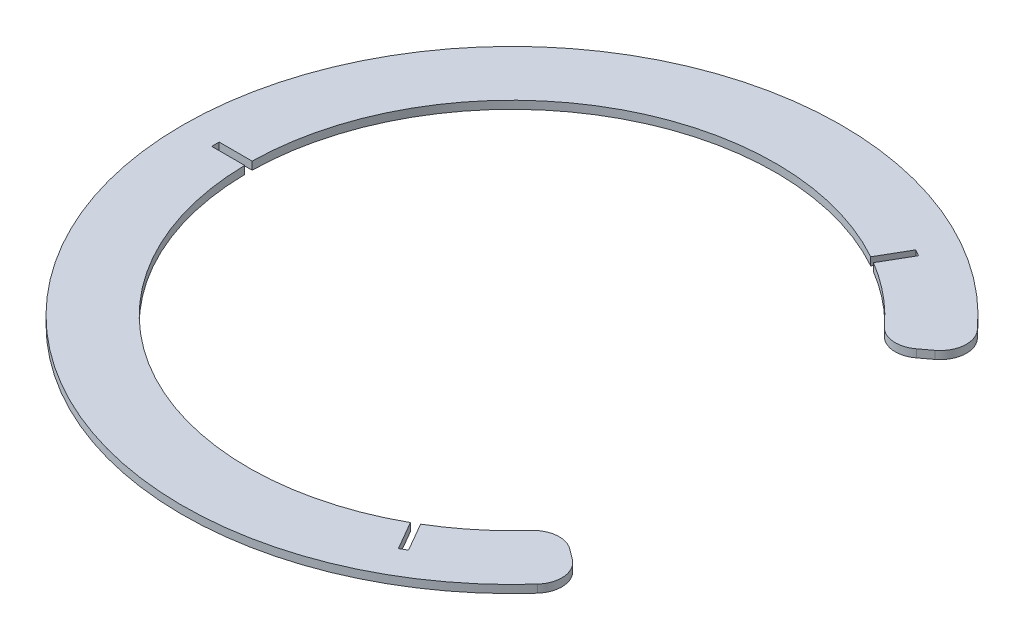
ISO-10303-21;
HEADER;
FILE_DESCRIPTION(('STEP AP214'),'2;1');
FILE_NAME('part.step','',(''),(''),'','','');
FILE_SCHEMA(('AUTOMOTIVE_DESIGN { 1 0 10303 214 1 1 1 1 }'));
ENDSEC;
DATA;
#1=APPLICATION_CONTEXT('core data for automotive mechanical design processes');
#2=APPLICATION_PROTOCOL_DEFINITION('international standard','automotive_design',2000,#1);
#3=PRODUCT_CONTEXT('',#1,'mechanical');
#4=PRODUCT('Part','Part','',(#3));
#5=PRODUCT_RELATED_PRODUCT_CATEGORY('part','',(#4));
#6=PRODUCT_DEFINITION_FORMATION('','',#4);
#7=PRODUCT_DEFINITION_CONTEXT('part definition',#1,'design');
#8=PRODUCT_DEFINITION('design','',#6,#7);
#9=PRODUCT_DEFINITION_SHAPE('','',#8);
#10=(LENGTH_UNIT() NAMED_UNIT(*) SI_UNIT(.MILLI.,.METRE.));
#11=(NAMED_UNIT(*) PLANE_ANGLE_UNIT() SI_UNIT($,.RADIAN.));
#12=(NAMED_UNIT(*) SI_UNIT($,.STERADIAN.) SOLID_ANGLE_UNIT());
#13=UNCERTAINTY_MEASURE_WITH_UNIT(LENGTH_MEASURE(1.E-05),#10,'distance_accuracy_value','');
#14=(GEOMETRIC_REPRESENTATION_CONTEXT(3) GLOBAL_UNCERTAINTY_ASSIGNED_CONTEXT((#13)) GLOBAL_UNIT_ASSIGNED_CONTEXT((#10,
#11,#12)) REPRESENTATION_CONTEXT('',''));
#15=CARTESIAN_POINT('',(0.,0.,0.));
#16=DIRECTION('',(0.,0.,1.));
#17=DIRECTION('',(1.,0.,0.));
#18=AXIS2_PLACEMENT_3D('',#15,#16,#17);
#19=CARTESIAN_POINT('',(0.,0.,0.));
#20=DIRECTION('',(0.,1.,0.));
#21=DIRECTION('',(0.,0.,1.));
#22=AXIS2_PLACEMENT_3D('',#19,#20,#21);
#23=CYLINDRICAL_SURFACE('',#22,100.);
#24=CARTESIAN_POINT('',(0.,0.,0.));
#25=DIRECTION('',(0.,1.,0.));
#26=DIRECTION('',(0.,0.,1.));
#27=AXIS2_PLACEMENT_3D('',#24,#25,#26);
#28=CIRCLE('',#27,100.);
#29=CARTESIAN_POINT('',(74.2141901825696,0.,-67.0242790005636));
#30=VERTEX_POINT('',#29);
#31=CARTESIAN_POINT('',(51.2204201332725,0.,-85.8863700558537));
#32=VERTEX_POINT('',#31);
#33=EDGE_CURVE('E256',#30,#32,#28,.T.);
#34=ORIENTED_EDGE('',*,*,#33,.F.);
#35=DIRECTION('',(0.,1.,0.));
#36=VECTOR('',#35,1.);
#37=CARTESIAN_POINT('',(74.2141901825696,0.,-67.0242790005636));
#38=LINE('',#37,#36);
#39=CARTESIAN_POINT('',(74.2141901825696,3.,-67.0242790005636));
#40=VERTEX_POINT('',#39);
#41=EDGE_CURVE('E11',#30,#40,#38,.T.);
#42=ORIENTED_EDGE('',*,*,#41,.T.);
#43=CARTESIAN_POINT('',(0.,3.,0.));
#44=DIRECTION('',(0.,1.,0.));
#45=DIRECTION('',(0.,0.,1.));
#46=AXIS2_PLACEMENT_3D('',#43,#44,#45);
#47=CIRCLE('',#46,100.);
#48=CARTESIAN_POINT('',(51.2204201332725,3.,-85.8863700558537));
#49=VERTEX_POINT('',#48);
#50=EDGE_CURVE('E262',#40,#49,#47,.T.);
#51=ORIENTED_EDGE('',*,*,#50,.T.);
#52=DIRECTION('',(0.,1.,0.));
#53=VECTOR('',#52,1.);
#54=CARTESIAN_POINT('',(51.2204201332725,0.,-85.8863700558537));
#55=LINE('',#54,#53);
#56=EDGE_CURVE('E277',#49,#32,#55,.F.);
#57=ORIENTED_EDGE('',*,*,#56,.T.);
#58=EDGE_LOOP('',(#34,#42,#51,#57));
#59=FACE_BOUND('',#58,.T.);
#60=ADVANCED_FACE('F33',(#59),#23,.F.);
#61=CARTESIAN_POINT('',(-99.9899883738367,3.,1.415));
#62=VERTEX_POINT('',#61);
#63=CARTESIAN_POINT('',(48.7695682405638,3.,87.301370055853));
#64=VERTEX_POINT('',#63);
#65=EDGE_CURVE('E257',#62,#64,#47,.T.);
#66=ORIENTED_EDGE('',*,*,#65,.T.);
#67=DIRECTION('',(0.,1.,0.));
#68=VECTOR('',#67,1.);
#69=CARTESIAN_POINT('',(48.7695682405638,0.,87.301370055853));
#70=LINE('',#69,#68);
#71=CARTESIAN_POINT('',(48.7695682405638,0.,87.301370055853));
#72=VERTEX_POINT('',#71);
#73=EDGE_CURVE('E281',#64,#72,#70,.F.);
#74=ORIENTED_EDGE('',*,*,#73,.T.);
#75=CARTESIAN_POINT('',(-99.9899883738367,0.,1.415));
#76=VERTEX_POINT('',#75);
#77=EDGE_CURVE('E252',#76,#72,#28,.T.);
#78=ORIENTED_EDGE('',*,*,#77,.F.);
#79=DIRECTION('',(0.,1.,0.));
#80=VECTOR('',#79,1.);
#81=CARTESIAN_POINT('',(-99.9899883738367,0.,1.415));
#82=LINE('',#81,#80);
#83=EDGE_CURVE('E266',#76,#62,#82,.T.);
#84=ORIENTED_EDGE('',*,*,#83,.T.);
#85=EDGE_LOOP('',(#66,#74,#78,#84));
#86=FACE_BOUND('',#85,.T.);
#87=ADVANCED_FACE('F380',(#86),#23,.F.);
#88=CARTESIAN_POINT('',(51.2204201332737,3.,85.886370055853));
#89=VERTEX_POINT('',#88);
#90=CARTESIAN_POINT('',(74.2073939229752,3.,67.0318035499596));
#91=VERTEX_POINT('',#90);
#92=EDGE_CURVE('E261',#89,#91,#47,.T.);
#93=ORIENTED_EDGE('',*,*,#92,.T.);
#94=DIRECTION('',(0.,1.,0.));
#95=VECTOR('',#94,1.);
#96=CARTESIAN_POINT('',(74.2073939229752,0.,67.0318035499596));
#97=LINE('',#96,#95);
#98=CARTESIAN_POINT('',(74.2073939229752,0.,67.0318035499596));
#99=VERTEX_POINT('',#98);
#100=EDGE_CURVE('E297',#91,#99,#97,.F.);
#101=ORIENTED_EDGE('',*,*,#100,.T.);
#102=CARTESIAN_POINT('',(51.2204201332737,0.,85.886370055853));
#103=VERTEX_POINT('',#102);
#104=EDGE_CURVE('E255',#103,#99,#28,.T.);
#105=ORIENTED_EDGE('',*,*,#104,.F.);
#106=DIRECTION('',(0.,1.,0.));
#107=VECTOR('',#106,1.);
#108=CARTESIAN_POINT('',(51.2204201332737,0.,85.886370055853));
#109=LINE('',#108,#107);
#110=EDGE_CURVE('E190',#103,#89,#109,.T.);
#111=ORIENTED_EDGE('',*,*,#110,.T.);
#112=EDGE_LOOP('',(#93,#101,#105,#111));
#113=FACE_BOUND('',#112,.T.);
#114=ADVANCED_FACE('F385',(#113),#23,.F.);
#115=CARTESIAN_POINT('',(0.,3.,0.));
#116=DIRECTION('',(0.,-1.,0.));
#117=DIRECTION('',(0.,0.,-1.));
#118=AXIS2_PLACEMENT_3D('',#115,#116,#117);
#119=CYLINDRICAL_SURFACE('',#118,125.);
#120=CARTESIAN_POINT('',(0.,0.,0.));
#121=DIRECTION('',(0.,1.,0.));
#122=DIRECTION('',(0.,0.,1.));
#123=AXIS2_PLACEMENT_3D('',#120,#121,#122);
#124=CIRCLE('',#123,125.);
#125=CARTESIAN_POINT('',(93.0994716294748,0.,-83.4115602438452));
#126=VERTEX_POINT('',#125);
#127=CARTESIAN_POINT('',(93.0871330036378,0.,83.4253299014337));
#128=VERTEX_POINT('',#127);
#129=EDGE_CURVE('E254',#126,#128,#124,.T.);
#130=ORIENTED_EDGE('',*,*,#129,.T.);
#131=DIRECTION('',(0.,-1.,0.));
#132=VECTOR('',#131,1.);
#133=CARTESIAN_POINT('',(93.0871330036378,3.,83.4253299014337));
#134=LINE('',#133,#132);
#135=CARTESIAN_POINT('',(93.0871330036378,3.,83.4253299014337));
#136=VERTEX_POINT('',#135);
#137=EDGE_CURVE('E308',#128,#136,#134,.F.);
#138=ORIENTED_EDGE('',*,*,#137,.T.);
#139=CARTESIAN_POINT('',(0.,3.,0.));
#140=DIRECTION('',(0.,1.,0.));
#141=DIRECTION('',(0.,0.,1.));
#142=AXIS2_PLACEMENT_3D('',#139,#140,#141);
#143=CIRCLE('',#142,125.);
#144=CARTESIAN_POINT('',(93.0994716294748,3.,-83.4115602438452));
#145=VERTEX_POINT('',#144);
#146=EDGE_CURVE('E263',#145,#136,#143,.T.);
#147=ORIENTED_EDGE('',*,*,#146,.F.);
#148=DIRECTION('',(0.,-1.,0.));
#149=VECTOR('',#148,1.);
#150=CARTESIAN_POINT('',(93.0994716294748,3.,-83.4115602438452));
#151=LINE('',#150,#149);
#152=EDGE_CURVE('E306',#145,#126,#151,.T.);
#153=ORIENTED_EDGE('',*,*,#152,.T.);
#154=EDGE_LOOP('',(#130,#138,#147,#153));
#155=FACE_BOUND('',#154,.T.);
#156=ADVANCED_FACE('F370',(#155),#119,.T.);
#157=CARTESIAN_POINT('',(0.,3.,0.));
#158=DIRECTION('',(0.,1.,0.));
#159=DIRECTION('',(0.,0.,1.));
#160=AXIS2_PLACEMENT_3D('',#157,#158,#159);
#161=PLANE('',#160);
#162=DIRECTION('',(0.799301578633206,0.,0.600930101088691));
#163=VECTOR('',#162,1.);
#164=CARTESIAN_POINT('',(80.,3.,60.));
#165=LINE('',#164,#163);
#166=CARTESIAN_POINT('',(87.6374343261596,3.,65.7419681186235));
#167=VERTEX_POINT('',#166);
#168=CARTESIAN_POINT('',(91.6494633742337,3.,68.7582877229869));
#169=VERTEX_POINT('',#168);
#170=EDGE_CURVE('E323',#167,#169,#165,.T.);
#171=ORIENTED_EDGE('',*,*,#170,.F.);
#172=CARTESIAN_POINT('',(81.6281333152727,3.,73.7349839049556));
#173=DIRECTION('',(0.,1.,0.));
#174=DIRECTION('',(0.,0.,1.));
#175=AXIS2_PLACEMENT_3D('',#172,#173,#174);
#176=CIRCLE('',#175,10.);
#177=EDGE_CURVE('E295',#167,#91,#176,.T.);
#178=ORIENTED_EDGE('',*,*,#177,.T.);
#179=ORIENTED_EDGE('',*,*,#92,.F.);
#180=DIRECTION('',(-0.500000000000004,0.,-0.866025403784436));
#181=VECTOR('',#180,1.);
#182=CARTESIAN_POINT('',(44.9754259463553,3.,75.0697228311382));
#183=LINE('',#182,#181);
#184=CARTESIAN_POINT('',(57.4754259463555,3.,96.7203579257491));
#185=VERTEX_POINT('',#184);
#186=EDGE_CURVE('E198',#185,#89,#183,.T.);
#187=ORIENTED_EDGE('',*,*,#186,.F.);
#188=DIRECTION('',(0.866025403784436,0.,-0.500000000000004));
#189=VECTOR('',#188,1.);
#190=CARTESIAN_POINT('',(57.4754259463555,3.,96.7203579257491));
#191=LINE('',#190,#189);
#192=CARTESIAN_POINT('',(55.0245740536455,3.,98.1353579257491));
#193=VERTEX_POINT('',#192);
#194=EDGE_CURVE('E180',#193,#185,#191,.T.);
#195=ORIENTED_EDGE('',*,*,#194,.F.);
#196=DIRECTION('',(0.500000000000004,0.,0.866025403784436));
#197=VECTOR('',#196,1.);
#198=CARTESIAN_POINT('',(42.5245740536454,3.,76.4847228311382));
#199=LINE('',#198,#197);
#200=EDGE_CURVE('E196',#64,#193,#199,.T.);
#201=ORIENTED_EDGE('',*,*,#200,.F.);
#202=ORIENTED_EDGE('',*,*,#65,.F.);
#203=DIRECTION('',(1.,0.,0.));
#204=VECTOR('',#203,1.);
#205=CARTESIAN_POINT('',(-87.5,3.,1.415));
#206=LINE('',#205,#204);
#207=CARTESIAN_POINT('',(-112.5,3.,1.415));
#208=VERTEX_POINT('',#207);
#209=EDGE_CURVE('E244',#208,#62,#206,.T.);
#210=ORIENTED_EDGE('',*,*,#209,.F.);
#211=DIRECTION('',(0.,0.,1.));
#212=VECTOR('',#211,1.);
#213=CARTESIAN_POINT('',(-112.5,3.,1.415));
#214=LINE('',#213,#212);
#215=CARTESIAN_POINT('',(-112.5,3.,-1.415));
#216=VERTEX_POINT('',#215);
#217=EDGE_CURVE('E208',#216,#208,#214,.T.);
#218=ORIENTED_EDGE('',*,*,#217,.F.);
#219=DIRECTION('',(-1.,0.,0.));
#220=VECTOR('',#219,1.);
#221=CARTESIAN_POINT('',(-87.5,3.,-1.415));
#222=LINE('',#221,#220);
#223=CARTESIAN_POINT('',(-99.9899883738367,3.,-1.415));
#224=VERTEX_POINT('',#223);
#225=EDGE_CURVE('E235',#224,#216,#222,.T.);
#226=ORIENTED_EDGE('',*,*,#225,.F.);
#227=CARTESIAN_POINT('',(48.7695682405626,3.,-87.3013700558537));
#228=VERTEX_POINT('',#227);
#229=EDGE_CURVE('E250',#228,#224,#47,.T.);
#230=ORIENTED_EDGE('',*,*,#229,.F.);
#231=DIRECTION('',(-0.499999999999992,0.,0.866025403784443));
#232=VECTOR('',#231,1.);
#233=CARTESIAN_POINT('',(42.5245740536443,3.,-76.4847228311388));
#234=LINE('',#233,#232);
#235=CARTESIAN_POINT('',(55.0245740536441,3.,-98.1353579257499));
#236=VERTEX_POINT('',#235);
#237=EDGE_CURVE('E224',#236,#228,#234,.T.);
#238=ORIENTED_EDGE('',*,*,#237,.F.);
#239=DIRECTION('',(-0.866025403784443,0.,-0.499999999999992));
#240=VECTOR('',#239,1.);
#241=CARTESIAN_POINT('',(55.0245740536441,3.,-98.1353579257499));
#242=LINE('',#241,#240);
#243=CARTESIAN_POINT('',(57.4754259463541,3.,-96.7203579257499));
#244=VERTEX_POINT('',#243);
#245=EDGE_CURVE('E221',#244,#236,#242,.T.);
#246=ORIENTED_EDGE('',*,*,#245,.F.);
#247=DIRECTION('',(0.499999999999992,0.,-0.866025403784443));
#248=VECTOR('',#247,1.);
#249=CARTESIAN_POINT('',(44.9754259463543,3.,-75.0697228311388));
#250=LINE('',#249,#248);
#251=EDGE_CURVE('E214',#49,#244,#250,.T.);
#252=ORIENTED_EDGE('',*,*,#251,.F.);
#253=ORIENTED_EDGE('',*,*,#50,.F.);
#254=CARTESIAN_POINT('',(81.6356092008266,3.,-73.7267069006199));
#255=DIRECTION('',(0.,1.,0.));
#256=DIRECTION('',(0.,0.,1.));
#257=AXIS2_PLACEMENT_3D('',#254,#255,#256);
#258=CIRCLE('',#257,10.);
#259=CARTESIAN_POINT('',(87.6356092008266,3.,-65.7267069006199));
#260=VERTEX_POINT('',#259);
#261=EDGE_CURVE('E289',#40,#260,#258,.T.);
#262=ORIENTED_EDGE('',*,*,#261,.T.);
#263=DIRECTION('',(-0.8,0.,0.6));
#264=VECTOR('',#263,1.);
#265=CARTESIAN_POINT('',(80.,3.,-60.));
#266=LINE('',#265,#264);
#267=CARTESIAN_POINT('',(91.6515138991168,3.,-68.7386354243376));
#268=VERTEX_POINT('',#267);
#269=EDGE_CURVE('E201',#268,#260,#266,.T.);
#270=ORIENTED_EDGE('',*,*,#269,.F.);
#271=CARTESIAN_POINT('',(85.6515138991168,3.,-76.7386354243376));
#272=DIRECTION('',(0.,1.,0.));
#273=DIRECTION('',(0.,0.,1.));
#274=AXIS2_PLACEMENT_3D('',#271,#272,#273);
#275=CIRCLE('',#274,10.);
#276=EDGE_CURVE('E291',#268,#145,#275,.T.);
#277=ORIENTED_EDGE('',*,*,#276,.T.);
#278=ORIENTED_EDGE('',*,*,#146,.T.);
#279=CARTESIAN_POINT('',(85.6401623633468,3.,76.751303509319));
#280=DIRECTION('',(0.,1.,0.));
#281=DIRECTION('',(0.,0.,1.));
#282=AXIS2_PLACEMENT_3D('',#279,#280,#281);
#283=CIRCLE('',#282,10.);
#284=EDGE_CURVE('E293',#136,#169,#283,.T.);
#285=ORIENTED_EDGE('',*,*,#284,.T.);
#286=EDGE_LOOP('',(#171,#178,#179,#187,#195,#201,#202,#210,#218,#226,#230,#238,#246,#252,#253,
#262,#270,#277,#278,#285));
#287=FACE_BOUND('',#286,.T.);
#288=ADVANCED_FACE('F319',(#287),#161,.T.);
#289=CARTESIAN_POINT('',(0.,0.,0.));
#290=DIRECTION('',(0.,1.,0.));
#291=DIRECTION('',(0.,0.,1.));
#292=AXIS2_PLACEMENT_3D('',#289,#290,#291);
#293=PLANE('',#292);
#294=ORIENTED_EDGE('',*,*,#104,.T.);
#295=CARTESIAN_POINT('',(81.6281333152727,0.,73.7349839049556));
#296=DIRECTION('',(0.,1.,0.));
#297=DIRECTION('',(0.,0.,1.));
#298=AXIS2_PLACEMENT_3D('',#295,#296,#297);
#299=CIRCLE('',#298,10.);
#300=CARTESIAN_POINT('',(87.6374343261596,0.,65.7419681186235));
#301=VERTEX_POINT('',#300);
#302=EDGE_CURVE('E304',#99,#301,#299,.F.);
#303=ORIENTED_EDGE('',*,*,#302,.T.);
#304=DIRECTION('',(0.799301578633206,0.,0.600930101088691));
#305=VECTOR('',#304,1.);
#306=CARTESIAN_POINT('',(80.,0.,60.));
#307=LINE('',#306,#305);
#308=CARTESIAN_POINT('',(91.6494633742337,0.,68.7582877229869));
#309=VERTEX_POINT('',#308);
#310=EDGE_CURVE('E322',#301,#309,#307,.T.);
#311=ORIENTED_EDGE('',*,*,#310,.T.);
#312=CARTESIAN_POINT('',(85.6401623633468,0.,76.751303509319));
#313=DIRECTION('',(0.,1.,0.));
#314=DIRECTION('',(0.,0.,1.));
#315=AXIS2_PLACEMENT_3D('',#312,#313,#314);
#316=CIRCLE('',#315,10.);
#317=EDGE_CURVE('E302',#309,#128,#316,.F.);
#318=ORIENTED_EDGE('',*,*,#317,.T.);
#319=ORIENTED_EDGE('',*,*,#129,.F.);
#320=CARTESIAN_POINT('',(85.6515138991168,0.,-76.7386354243376));
#321=DIRECTION('',(0.,1.,0.));
#322=DIRECTION('',(0.,0.,1.));
#323=AXIS2_PLACEMENT_3D('',#320,#321,#322);
#324=CIRCLE('',#323,10.);
#325=CARTESIAN_POINT('',(91.6515138991168,0.,-68.7386354243376));
#326=VERTEX_POINT('',#325);
#327=EDGE_CURVE('E300',#126,#326,#324,.F.);
#328=ORIENTED_EDGE('',*,*,#327,.T.);
#329=DIRECTION('',(-0.8,0.,0.6));
#330=VECTOR('',#329,1.);
#331=CARTESIAN_POINT('',(80.,0.,-60.));
#332=LINE('',#331,#330);
#333=CARTESIAN_POINT('',(87.6356092008266,0.,-65.7267069006199));
#334=VERTEX_POINT('',#333);
#335=EDGE_CURVE('E225',#326,#334,#332,.T.);
#336=ORIENTED_EDGE('',*,*,#335,.T.);
#337=CARTESIAN_POINT('',(81.6356092008266,0.,-73.7267069006199));
#338=DIRECTION('',(0.,1.,0.));
#339=DIRECTION('',(0.,0.,1.));
#340=AXIS2_PLACEMENT_3D('',#337,#338,#339);
#341=CIRCLE('',#340,10.);
#342=EDGE_CURVE('E48',#334,#30,#341,.F.);
#343=ORIENTED_EDGE('',*,*,#342,.T.);
#344=ORIENTED_EDGE('',*,*,#33,.T.);
#345=DIRECTION('',(0.499999999999992,0.,-0.866025403784443));
#346=VECTOR('',#345,1.);
#347=CARTESIAN_POINT('',(44.9754259463543,0.,-75.0697228311388));
#348=LINE('',#347,#346);
#349=CARTESIAN_POINT('',(57.4754259463541,0.,-96.7203579257499));
#350=VERTEX_POINT('',#349);
#351=EDGE_CURVE('E217',#32,#350,#348,.T.);
#352=ORIENTED_EDGE('',*,*,#351,.T.);
#353=DIRECTION('',(-0.866025403784443,0.,-0.499999999999992));
#354=VECTOR('',#353,1.);
#355=CARTESIAN_POINT('',(55.0245740536441,0.,-98.1353579257499));
#356=LINE('',#355,#354);
#357=CARTESIAN_POINT('',(55.0245740536441,0.,-98.1353579257499));
#358=VERTEX_POINT('',#357);
#359=EDGE_CURVE('E210',#350,#358,#356,.T.);
#360=ORIENTED_EDGE('',*,*,#359,.T.);
#361=DIRECTION('',(-0.499999999999992,0.,0.866025403784443));
#362=VECTOR('',#361,1.);
#363=CARTESIAN_POINT('',(42.5245740536443,0.,-76.4847228311388));
#364=LINE('',#363,#362);
#365=CARTESIAN_POINT('',(48.7695682405626,0.,-87.3013700558537));
#366=VERTEX_POINT('',#365);
#367=EDGE_CURVE('E213',#358,#366,#364,.T.);
#368=ORIENTED_EDGE('',*,*,#367,.T.);
#369=CARTESIAN_POINT('',(-99.9899883738367,0.,-1.415));
#370=VERTEX_POINT('',#369);
#371=EDGE_CURVE('E260',#366,#370,#28,.T.);
#372=ORIENTED_EDGE('',*,*,#371,.T.);
#373=DIRECTION('',(-1.,0.,0.));
#374=VECTOR('',#373,1.);
#375=CARTESIAN_POINT('',(-87.5,0.,-1.415));
#376=LINE('',#375,#374);
#377=CARTESIAN_POINT('',(-112.5,0.,-1.415));
#378=VERTEX_POINT('',#377);
#379=EDGE_CURVE('E238',#370,#378,#376,.T.);
#380=ORIENTED_EDGE('',*,*,#379,.T.);
#381=DIRECTION('',(0.,0.,1.));
#382=VECTOR('',#381,1.);
#383=CARTESIAN_POINT('',(-112.5,0.,1.415));
#384=LINE('',#383,#382);
#385=CARTESIAN_POINT('',(-112.5,0.,1.415));
#386=VERTEX_POINT('',#385);
#387=EDGE_CURVE('E231',#378,#386,#384,.T.);
#388=ORIENTED_EDGE('',*,*,#387,.T.);
#389=DIRECTION('',(1.,0.,0.));
#390=VECTOR('',#389,1.);
#391=CARTESIAN_POINT('',(-87.5,0.,1.415));
#392=LINE('',#391,#390);
#393=EDGE_CURVE('E234',#386,#76,#392,.T.);
#394=ORIENTED_EDGE('',*,*,#393,.T.);
#395=ORIENTED_EDGE('',*,*,#77,.T.);
#396=DIRECTION('',(0.500000000000004,0.,0.866025403784436));
#397=VECTOR('',#396,1.);
#398=CARTESIAN_POINT('',(42.5245740536454,0.,76.4847228311382));
#399=LINE('',#398,#397);
#400=CARTESIAN_POINT('',(55.0245740536455,0.,98.1353579257491));
#401=VERTEX_POINT('',#400);
#402=EDGE_CURVE('E184',#72,#401,#399,.T.);
#403=ORIENTED_EDGE('',*,*,#402,.T.);
#404=DIRECTION('',(0.866025403784436,0.,-0.500000000000004));
#405=VECTOR('',#404,1.);
#406=CARTESIAN_POINT('',(57.4754259463555,0.,96.7203579257491));
#407=LINE('',#406,#405);
#408=CARTESIAN_POINT('',(57.4754259463555,0.,96.7203579257491));
#409=VERTEX_POINT('',#408);
#410=EDGE_CURVE('E177',#401,#409,#407,.T.);
#411=ORIENTED_EDGE('',*,*,#410,.T.);
#412=DIRECTION('',(-0.500000000000004,0.,-0.866025403784436));
#413=VECTOR('',#412,1.);
#414=CARTESIAN_POINT('',(44.9754259463553,0.,75.0697228311382));
#415=LINE('',#414,#413);
#416=EDGE_CURVE('E187',#409,#103,#415,.T.);
#417=ORIENTED_EDGE('',*,*,#416,.T.);
#418=EDGE_LOOP('',(#294,#303,#311,#318,#319,#328,#336,#343,#344,#352,#360,#368,#372,#380,#388,
#394,#395,#403,#411,#417));
#419=FACE_BOUND('',#418,.T.);
#420=ADVANCED_FACE('F194',(#419),#293,.F.);
#421=ORIENTED_EDGE('',*,*,#371,.F.);
#422=DIRECTION('',(0.,1.,0.));
#423=VECTOR('',#422,1.);
#424=CARTESIAN_POINT('',(48.7695682405625,0.,-87.3013700558537));
#425=LINE('',#424,#423);
#426=EDGE_CURVE('E274',#366,#228,#425,.T.);
#427=ORIENTED_EDGE('',*,*,#426,.T.);
#428=ORIENTED_EDGE('',*,*,#229,.T.);
#429=DIRECTION('',(0.,1.,0.));
#430=VECTOR('',#429,1.);
#431=CARTESIAN_POINT('',(-99.9899883738367,0.,-1.415));
#432=LINE('',#431,#430);
#433=EDGE_CURVE('E271',#224,#370,#432,.F.);
#434=ORIENTED_EDGE('',*,*,#433,.T.);
#435=EDGE_LOOP('',(#421,#427,#428,#434));
#436=FACE_BOUND('',#435,.T.);
#437=ADVANCED_FACE('F342',(#436),#23,.F.);
#438=CARTESIAN_POINT('',(-87.5,0.,-1.415));
#439=DIRECTION('',(0.,0.,-1.));
#440=DIRECTION('',(-1.,0.,0.));
#441=AXIS2_PLACEMENT_3D('',#438,#439,#440);
#442=PLANE('',#441);
#443=ORIENTED_EDGE('',*,*,#225,.T.);
#444=DIRECTION('',(0.,1.,0.));
#445=VECTOR('',#444,1.);
#446=CARTESIAN_POINT('',(-112.5,0.,-1.415));
#447=LINE('',#446,#445);
#448=EDGE_CURVE('E247',#378,#216,#447,.T.);
#449=ORIENTED_EDGE('',*,*,#448,.F.);
#450=ORIENTED_EDGE('',*,*,#379,.F.);
#451=ORIENTED_EDGE('',*,*,#433,.F.);
#452=EDGE_LOOP('',(#443,#449,#450,#451));
#453=FACE_BOUND('',#452,.T.);
#454=ADVANCED_FACE('F347',(#453),#442,.F.);
#455=CARTESIAN_POINT('',(-87.5,0.,1.415));
#456=DIRECTION('',(0.,0.,1.));
#457=DIRECTION('',(1.,0.,0.));
#458=AXIS2_PLACEMENT_3D('',#455,#456,#457);
#459=PLANE('',#458);
#460=ORIENTED_EDGE('',*,*,#393,.F.);
#461=DIRECTION('',(0.,1.,0.));
#462=VECTOR('',#461,1.);
#463=CARTESIAN_POINT('',(-112.5,0.,1.415));
#464=LINE('',#463,#462);
#465=EDGE_CURVE('E241',#386,#208,#464,.T.);
#466=ORIENTED_EDGE('',*,*,#465,.T.);
#467=ORIENTED_EDGE('',*,*,#209,.T.);
#468=ORIENTED_EDGE('',*,*,#83,.F.);
#469=EDGE_LOOP('',(#460,#466,#467,#468));
#470=FACE_BOUND('',#469,.T.);
#471=ADVANCED_FACE('F394',(#470),#459,.F.);
#472=CARTESIAN_POINT('',(-112.5,0.,1.415));
#473=DIRECTION('',(-1.,0.,0.));
#474=DIRECTION('',(0.,0.,1.));
#475=AXIS2_PLACEMENT_3D('',#472,#473,#474);
#476=PLANE('',#475);
#477=ORIENTED_EDGE('',*,*,#217,.T.);
#478=ORIENTED_EDGE('',*,*,#465,.F.);
#479=ORIENTED_EDGE('',*,*,#387,.F.);
#480=ORIENTED_EDGE('',*,*,#448,.T.);
#481=EDGE_LOOP('',(#477,#478,#479,#480));
#482=FACE_BOUND('',#481,.T.);
#483=ADVANCED_FACE('F352',(#482),#476,.F.);
#484=CARTESIAN_POINT('',(44.9754259463543,0.,-75.0697228311388));
#485=DIRECTION('',(0.866025403784443,0.,0.499999999999992));
#486=DIRECTION('',(0.499999999999992,0.,-0.866025403784443));
#487=AXIS2_PLACEMENT_3D('',#484,#485,#486);
#488=PLANE('',#487);
#489=ORIENTED_EDGE('',*,*,#251,.T.);
#490=DIRECTION('',(0.,1.,0.));
#491=VECTOR('',#490,1.);
#492=CARTESIAN_POINT('',(57.4754259463541,0.,-96.7203579257499));
#493=LINE('',#492,#491);
#494=EDGE_CURVE('E206',#350,#244,#493,.T.);
#495=ORIENTED_EDGE('',*,*,#494,.F.);
#496=ORIENTED_EDGE('',*,*,#351,.F.);
#497=ORIENTED_EDGE('',*,*,#56,.F.);
#498=EDGE_LOOP('',(#489,#495,#496,#497));
#499=FACE_BOUND('',#498,.T.);
#500=ADVANCED_FACE('F411',(#499),#488,.F.);
#501=CARTESIAN_POINT('',(42.5245740536443,0.,-76.4847228311388));
#502=DIRECTION('',(-0.866025403784443,0.,-0.499999999999992));
#503=DIRECTION('',(-0.499999999999992,0.,0.866025403784443));
#504=AXIS2_PLACEMENT_3D('',#501,#502,#503);
#505=PLANE('',#504);
#506=ORIENTED_EDGE('',*,*,#367,.F.);
#507=DIRECTION('',(0.,1.,0.));
#508=VECTOR('',#507,1.);
#509=CARTESIAN_POINT('',(55.0245740536441,0.,-98.1353579257499));
#510=LINE('',#509,#508);
#511=EDGE_CURVE('E220',#358,#236,#510,.T.);
#512=ORIENTED_EDGE('',*,*,#511,.T.);
#513=ORIENTED_EDGE('',*,*,#237,.T.);
#514=ORIENTED_EDGE('',*,*,#426,.F.);
#515=EDGE_LOOP('',(#506,#512,#513,#514));
#516=FACE_BOUND('',#515,.T.);
#517=ADVANCED_FACE('F417',(#516),#505,.F.);
#518=CARTESIAN_POINT('',(55.0245740536441,0.,-98.1353579257499));
#519=DIRECTION('',(0.499999999999992,0.,-0.866025403784443));
#520=DIRECTION('',(-0.866025403784443,0.,-0.499999999999992));
#521=AXIS2_PLACEMENT_3D('',#518,#519,#520);
#522=PLANE('',#521);
#523=ORIENTED_EDGE('',*,*,#245,.T.);
#524=ORIENTED_EDGE('',*,*,#511,.F.);
#525=ORIENTED_EDGE('',*,*,#359,.F.);
#526=ORIENTED_EDGE('',*,*,#494,.T.);
#527=EDGE_LOOP('',(#523,#524,#525,#526));
#528=FACE_BOUND('',#527,.T.);
#529=ADVANCED_FACE('F413',(#528),#522,.F.);
#530=CARTESIAN_POINT('',(42.5245740536454,0.,76.4847228311382));
#531=DIRECTION('',(-0.866025403784436,0.,0.500000000000004));
#532=DIRECTION('',(0.500000000000004,0.,0.866025403784436));
#533=AXIS2_PLACEMENT_3D('',#530,#531,#532);
#534=PLANE('',#533);
#535=ORIENTED_EDGE('',*,*,#200,.T.);
#536=DIRECTION('',(0.,1.,0.));
#537=VECTOR('',#536,1.);
#538=CARTESIAN_POINT('',(55.0245740536455,0.,98.1353579257491));
#539=LINE('',#538,#537);
#540=EDGE_CURVE('E183',#401,#193,#539,.T.);
#541=ORIENTED_EDGE('',*,*,#540,.F.);
#542=ORIENTED_EDGE('',*,*,#402,.F.);
#543=ORIENTED_EDGE('',*,*,#73,.F.);
#544=EDGE_LOOP('',(#535,#541,#542,#543));
#545=FACE_BOUND('',#544,.T.);
#546=ADVANCED_FACE('F416',(#545),#534,.F.);
#547=CARTESIAN_POINT('',(44.9754259463553,0.,75.0697228311382));
#548=DIRECTION('',(0.866025403784436,0.,-0.500000000000004));
#549=DIRECTION('',(-0.500000000000004,0.,-0.866025403784436));
#550=AXIS2_PLACEMENT_3D('',#547,#548,#549);
#551=PLANE('',#550);
#552=ORIENTED_EDGE('',*,*,#416,.F.);
#553=DIRECTION('',(0.,1.,0.));
#554=VECTOR('',#553,1.);
#555=CARTESIAN_POINT('',(57.4754259463555,0.,96.7203579257491));
#556=LINE('',#555,#554);
#557=EDGE_CURVE('E172',#409,#185,#556,.T.);
#558=ORIENTED_EDGE('',*,*,#557,.T.);
#559=ORIENTED_EDGE('',*,*,#186,.T.);
#560=ORIENTED_EDGE('',*,*,#110,.F.);
#561=EDGE_LOOP('',(#552,#558,#559,#560));
#562=FACE_BOUND('',#561,.T.);
#563=ADVANCED_FACE('F188',(#562),#551,.F.);
#564=CARTESIAN_POINT('',(57.4754259463555,0.,96.7203579257491));
#565=DIRECTION('',(0.500000000000004,0.,0.866025403784436));
#566=DIRECTION('',(0.866025403784436,0.,-0.500000000000004));
#567=AXIS2_PLACEMENT_3D('',#564,#565,#566);
#568=PLANE('',#567);
#569=ORIENTED_EDGE('',*,*,#194,.T.);
#570=ORIENTED_EDGE('',*,*,#557,.F.);
#571=ORIENTED_EDGE('',*,*,#410,.F.);
#572=ORIENTED_EDGE('',*,*,#540,.T.);
#573=EDGE_LOOP('',(#569,#570,#571,#572));
#574=FACE_BOUND('',#573,.T.);
#575=ADVANCED_FACE('F174',(#574),#568,.F.);
#576=CARTESIAN_POINT('',(80.,0.,60.));
#577=DIRECTION('',(-0.600930101088691,0.,0.799301578633206));
#578=DIRECTION('',(0.799301578633206,0.,0.600930101088691));
#579=AXIS2_PLACEMENT_3D('',#576,#577,#578);
#580=PLANE('',#579);
#581=ORIENTED_EDGE('',*,*,#310,.F.);
#582=DIRECTION('',(0.,1.,0.));
#583=VECTOR('',#582,1.);
#584=CARTESIAN_POINT('',(87.6374343261596,0.,65.7419681186235));
#585=LINE('',#584,#583);
#586=EDGE_CURVE('E286',#301,#167,#585,.T.);
#587=ORIENTED_EDGE('',*,*,#586,.T.);
#588=ORIENTED_EDGE('',*,*,#170,.T.);
#589=DIRECTION('',(0.,-1.,0.));
#590=VECTOR('',#589,1.);
#591=CARTESIAN_POINT('',(91.6494633742337,0.,68.7582877229869));
#592=LINE('',#591,#590);
#593=EDGE_CURVE('E284',#169,#309,#592,.T.);
#594=ORIENTED_EDGE('',*,*,#593,.T.);
#595=EDGE_LOOP('',(#581,#587,#588,#594));
#596=FACE_BOUND('',#595,.T.);
#597=ADVANCED_FACE('F363',(#596),#580,.F.);
#598=CARTESIAN_POINT('',(80.,0.,-60.));
#599=DIRECTION('',(-0.6,0.,-0.8));
#600=DIRECTION('',(-0.8,0.,0.6));
#601=AXIS2_PLACEMENT_3D('',#598,#599,#600);
#602=PLANE('',#601);
#603=ORIENTED_EDGE('',*,*,#335,.F.);
#604=DIRECTION('',(0.,-1.,0.));
#605=VECTOR('',#604,1.);
#606=CARTESIAN_POINT('',(91.6515138991168,0.,-68.7386354243376));
#607=LINE('',#606,#605);
#608=EDGE_CURVE('E41',#326,#268,#607,.F.);
#609=ORIENTED_EDGE('',*,*,#608,.T.);
#610=ORIENTED_EDGE('',*,*,#269,.T.);
#611=DIRECTION('',(0.,1.,0.));
#612=VECTOR('',#611,1.);
#613=CARTESIAN_POINT('',(87.6356092008266,0.,-65.7267069006199));
#614=LINE('',#613,#612);
#615=EDGE_CURVE('E56',#260,#334,#614,.F.);
#616=ORIENTED_EDGE('',*,*,#615,.T.);
#617=EDGE_LOOP('',(#603,#609,#610,#616));
#618=FACE_BOUND('',#617,.T.);
#619=ADVANCED_FACE('F314',(#618),#602,.F.);
#620=CARTESIAN_POINT('',(81.6281333152727,0.,73.7349839049556));
#621=DIRECTION('',(0.,1.,0.));
#622=DIRECTION('',(0.,0.,1.));
#623=AXIS2_PLACEMENT_3D('',#620,#621,#622);
#624=CYLINDRICAL_SURFACE('',#623,10.);
#625=ORIENTED_EDGE('',*,*,#302,.F.);
#626=ORIENTED_EDGE('',*,*,#100,.F.);
#627=ORIENTED_EDGE('',*,*,#177,.F.);
#628=ORIENTED_EDGE('',*,*,#586,.F.);
#629=EDGE_LOOP('',(#625,#626,#627,#628));
#630=FACE_BOUND('',#629,.T.);
#631=ADVANCED_FACE('F362',(#630),#624,.T.);
#632=CARTESIAN_POINT('',(85.6401623633468,3.,76.751303509319));
#633=DIRECTION('',(0.,-1.,0.));
#634=DIRECTION('',(0.,0.,-1.));
#635=AXIS2_PLACEMENT_3D('',#632,#633,#634);
#636=CYLINDRICAL_SURFACE('',#635,10.);
#637=ORIENTED_EDGE('',*,*,#317,.F.);
#638=ORIENTED_EDGE('',*,*,#593,.F.);
#639=ORIENTED_EDGE('',*,*,#284,.F.);
#640=ORIENTED_EDGE('',*,*,#137,.F.);
#641=EDGE_LOOP('',(#637,#638,#639,#640));
#642=FACE_BOUND('',#641,.T.);
#643=ADVANCED_FACE('F368',(#642),#636,.T.);
#644=CARTESIAN_POINT('',(85.6515138991168,3.,-76.7386354243376));
#645=DIRECTION('',(0.,-1.,0.));
#646=DIRECTION('',(0.,0.,-1.));
#647=AXIS2_PLACEMENT_3D('',#644,#645,#646);
#648=CYLINDRICAL_SURFACE('',#647,10.);
#649=ORIENTED_EDGE('',*,*,#327,.F.);
#650=ORIENTED_EDGE('',*,*,#152,.F.);
#651=ORIENTED_EDGE('',*,*,#276,.F.);
#652=ORIENTED_EDGE('',*,*,#608,.F.);
#653=EDGE_LOOP('',(#649,#650,#651,#652));
#654=FACE_BOUND('',#653,.T.);
#655=ADVANCED_FACE('F372',(#654),#648,.T.);
#656=CARTESIAN_POINT('',(81.6356092008266,0.,-73.7267069006199));
#657=DIRECTION('',(0.,1.,0.));
#658=DIRECTION('',(0.,0.,1.));
#659=AXIS2_PLACEMENT_3D('',#656,#657,#658);
#660=CYLINDRICAL_SURFACE('',#659,10.);
#661=ORIENTED_EDGE('',*,*,#342,.F.);
#662=ORIENTED_EDGE('',*,*,#615,.F.);
#663=ORIENTED_EDGE('',*,*,#261,.F.);
#664=ORIENTED_EDGE('',*,*,#41,.F.);
#665=EDGE_LOOP('',(#661,#662,#663,#664));
#666=FACE_BOUND('',#665,.T.);
#667=ADVANCED_FACE('F35',(#666),#660,.T.);
#668=CLOSED_SHELL('',(#60,#87,#114,#156,#288,#420,#437,#454,#471,#483,#500,#517,#529,#546,#563,
#575,#597,#619,#631,#643,#655,#667));
#669=MANIFOLD_SOLID_BREP('B2',#668);
#670=ADVANCED_BREP_SHAPE_REPRESENTATION('',(#18,#669),#14);
#671=SHAPE_DEFINITION_REPRESENTATION(#9,#670);
ENDSEC;
END-ISO-10303-21;
